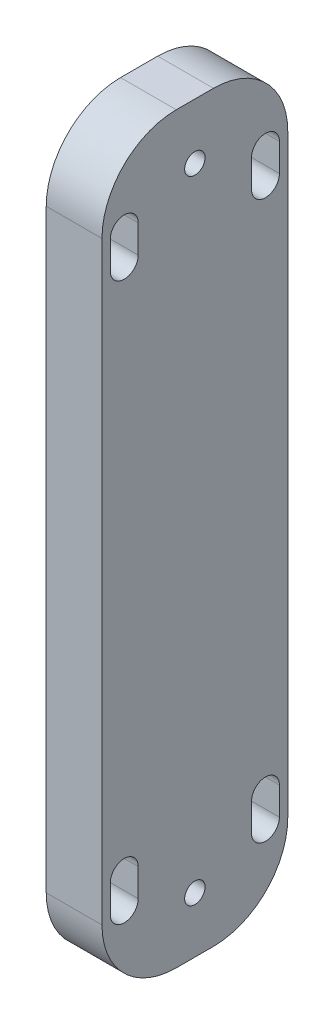
ISO-10303-21;
HEADER;
FILE_DESCRIPTION(('STEP AP214'),'2;1');
FILE_NAME('part.step','',(''),(''),'','','');
FILE_SCHEMA(('AUTOMOTIVE_DESIGN { 1 0 10303 214 1 1 1 1 }'));
ENDSEC;
DATA;
#1=APPLICATION_CONTEXT('core data for automotive mechanical design processes');
#2=APPLICATION_PROTOCOL_DEFINITION('international standard','automotive_design',2000,#1);
#3=PRODUCT_CONTEXT('',#1,'mechanical');
#4=PRODUCT('Part','Part','',(#3));
#5=PRODUCT_RELATED_PRODUCT_CATEGORY('part','',(#4));
#6=PRODUCT_DEFINITION_FORMATION('','',#4);
#7=PRODUCT_DEFINITION_CONTEXT('part definition',#1,'design');
#8=PRODUCT_DEFINITION('design','',#6,#7);
#9=PRODUCT_DEFINITION_SHAPE('','',#8);
#10=(LENGTH_UNIT() NAMED_UNIT(*) SI_UNIT(.MILLI.,.METRE.));
#11=(NAMED_UNIT(*) PLANE_ANGLE_UNIT() SI_UNIT($,.RADIAN.));
#12=(NAMED_UNIT(*) SI_UNIT($,.STERADIAN.) SOLID_ANGLE_UNIT());
#13=UNCERTAINTY_MEASURE_WITH_UNIT(LENGTH_MEASURE(1.E-05),#10,'distance_accuracy_value','');
#14=(GEOMETRIC_REPRESENTATION_CONTEXT(3) GLOBAL_UNCERTAINTY_ASSIGNED_CONTEXT((#13)) GLOBAL_UNIT_ASSIGNED_CONTEXT((#10,
#11,#12)) REPRESENTATION_CONTEXT('',''));
#15=CARTESIAN_POINT('',(0.,0.,0.));
#16=DIRECTION('',(0.,0.,1.));
#17=DIRECTION('',(1.,0.,0.));
#18=AXIS2_PLACEMENT_3D('',#15,#16,#17);
#19=CARTESIAN_POINT('',(3.,36.,-6.));
#20=DIRECTION('',(-1.,0.,0.));
#21=DIRECTION('',(0.,0.,1.));
#22=AXIS2_PLACEMENT_3D('',#19,#20,#21);
#23=PLANE('',#22);
#24=CARTESIAN_POINT('',(3.,4.25,-8.8));
#25=DIRECTION('',(1.,0.,0.));
#26=DIRECTION('',(0.,0.,-1.));
#27=AXIS2_PLACEMENT_3D('',#24,#25,#26);
#28=CIRCLE('',#27,0.750000000000001);
#29=CARTESIAN_POINT('',(3.,4.25,-8.05));
#30=VERTEX_POINT('',#29);
#31=CARTESIAN_POINT('',(3.,4.25,-9.55));
#32=VERTEX_POINT('',#31);
#33=EDGE_CURVE('E232',#30,#32,#28,.T.);
#34=ORIENTED_EDGE('',*,*,#33,.F.);
#35=DIRECTION('',(0.,-1.,0.));
#36=VECTOR('',#35,1.);
#37=CARTESIAN_POINT('',(3.,4.25,-8.05));
#38=LINE('',#37,#36);
#39=CARTESIAN_POINT('',(3.,5.75,-8.05));
#40=VERTEX_POINT('',#39);
#41=EDGE_CURVE('E240',#40,#30,#38,.T.);
#42=ORIENTED_EDGE('',*,*,#41,.F.);
#43=CARTESIAN_POINT('',(3.,5.75,-8.8));
#44=DIRECTION('',(1.,0.,0.));
#45=DIRECTION('',(0.,0.,-1.));
#46=AXIS2_PLACEMENT_3D('',#43,#44,#45);
#47=CIRCLE('',#46,0.750000000000001);
#48=CARTESIAN_POINT('',(3.,5.75,-9.55));
#49=VERTEX_POINT('',#48);
#50=EDGE_CURVE('E237',#49,#40,#47,.T.);
#51=ORIENTED_EDGE('',*,*,#50,.F.);
#52=DIRECTION('',(0.,1.,0.));
#53=VECTOR('',#52,1.);
#54=CARTESIAN_POINT('',(3.,4.25,-9.55));
#55=LINE('',#54,#53);
#56=EDGE_CURVE('E234',#32,#49,#55,.T.);
#57=ORIENTED_EDGE('',*,*,#56,.F.);
#58=EDGE_LOOP('',(#34,#42,#51,#57));
#59=FACE_BOUND('',#58,.T.);
#60=CARTESIAN_POINT('',(3.,35.75,-1.2));
#61=DIRECTION('',(1.,0.,0.));
#62=DIRECTION('',(0.,0.,-1.));
#63=AXIS2_PLACEMENT_3D('',#60,#61,#62);
#64=CIRCLE('',#63,0.749999999999999);
#65=CARTESIAN_POINT('',(3.,35.75,-1.95));
#66=VERTEX_POINT('',#65);
#67=CARTESIAN_POINT('',(3.,35.75,-0.45));
#68=VERTEX_POINT('',#67);
#69=EDGE_CURVE('E306',#66,#68,#64,.T.);
#70=ORIENTED_EDGE('',*,*,#69,.F.);
#71=DIRECTION('',(0.,1.,0.));
#72=VECTOR('',#71,1.);
#73=CARTESIAN_POINT('',(3.,35.75,-1.95));
#74=LINE('',#73,#72);
#75=CARTESIAN_POINT('',(3.,34.25,-1.95));
#76=VERTEX_POINT('',#75);
#77=EDGE_CURVE('E314',#76,#66,#74,.T.);
#78=ORIENTED_EDGE('',*,*,#77,.F.);
#79=CARTESIAN_POINT('',(3.,34.25,-1.2));
#80=DIRECTION('',(1.,0.,0.));
#81=DIRECTION('',(0.,0.,-1.));
#82=AXIS2_PLACEMENT_3D('',#79,#80,#81);
#83=CIRCLE('',#82,0.749999999999999);
#84=CARTESIAN_POINT('',(3.,34.25,-0.450000000000001));
#85=VERTEX_POINT('',#84);
#86=EDGE_CURVE('E311',#85,#76,#83,.T.);
#87=ORIENTED_EDGE('',*,*,#86,.F.);
#88=DIRECTION('',(0.,-1.,0.));
#89=VECTOR('',#88,1.);
#90=CARTESIAN_POINT('',(3.,35.75,-0.45));
#91=LINE('',#90,#89);
#92=EDGE_CURVE('E308',#68,#85,#91,.T.);
#93=ORIENTED_EDGE('',*,*,#92,.F.);
#94=EDGE_LOOP('',(#70,#78,#87,#93));
#95=FACE_BOUND('',#94,.T.);
#96=CARTESIAN_POINT('',(3.,36.,-6.));
#97=DIRECTION('',(1.,0.,0.));
#98=DIRECTION('',(0.,0.,1.));
#99=AXIS2_PLACEMENT_3D('',#96,#97,#98);
#100=CIRCLE('',#99,3.99999999999999);
#101=CARTESIAN_POINT('',(3.,36.,-10.));
#102=VERTEX_POINT('',#101);
#103=CARTESIAN_POINT('',(3.,40.,-6.));
#104=VERTEX_POINT('',#103);
#105=EDGE_CURVE('E337',#102,#104,#100,.T.);
#106=ORIENTED_EDGE('',*,*,#105,.T.);
#107=DIRECTION('',(0.,0.,1.));
#108=VECTOR('',#107,1.);
#109=CARTESIAN_POINT('',(3.,40.,-4.));
#110=LINE('',#109,#108);
#111=CARTESIAN_POINT('',(3.,40.,-4.));
#112=VERTEX_POINT('',#111);
#113=EDGE_CURVE('E340',#104,#112,#110,.T.);
#114=ORIENTED_EDGE('',*,*,#113,.T.);
#115=CARTESIAN_POINT('',(3.,36.,-4.));
#116=DIRECTION('',(1.,0.,0.));
#117=DIRECTION('',(0.,0.,1.));
#118=AXIS2_PLACEMENT_3D('',#115,#116,#117);
#119=CIRCLE('',#118,3.99999999999999);
#120=CARTESIAN_POINT('',(3.,36.,0.));
#121=VERTEX_POINT('',#120);
#122=EDGE_CURVE('E343',#112,#121,#119,.T.);
#123=ORIENTED_EDGE('',*,*,#122,.T.);
#124=DIRECTION('',(0.,-1.,0.));
#125=VECTOR('',#124,1.);
#126=CARTESIAN_POINT('',(3.,4.,0.));
#127=LINE('',#126,#125);
#128=CARTESIAN_POINT('',(3.,4.,0.));
#129=VERTEX_POINT('',#128);
#130=EDGE_CURVE('E345',#121,#129,#127,.T.);
#131=ORIENTED_EDGE('',*,*,#130,.T.);
#132=CARTESIAN_POINT('',(3.,4.,-4.));
#133=DIRECTION('',(1.,0.,0.));
#134=DIRECTION('',(0.,0.,1.));
#135=AXIS2_PLACEMENT_3D('',#132,#133,#134);
#136=CIRCLE('',#135,4.);
#137=CARTESIAN_POINT('',(3.,0.,-4.));
#138=VERTEX_POINT('',#137);
#139=EDGE_CURVE('E347',#129,#138,#136,.T.);
#140=ORIENTED_EDGE('',*,*,#139,.T.);
#141=DIRECTION('',(0.,0.,-1.));
#142=VECTOR('',#141,1.);
#143=CARTESIAN_POINT('',(3.,0.,-4.));
#144=LINE('',#143,#142);
#145=CARTESIAN_POINT('',(3.,0.,-6.));
#146=VERTEX_POINT('',#145);
#147=EDGE_CURVE('E349',#138,#146,#144,.T.);
#148=ORIENTED_EDGE('',*,*,#147,.T.);
#149=CARTESIAN_POINT('',(3.,4.,-6.));
#150=DIRECTION('',(1.,0.,0.));
#151=DIRECTION('',(0.,0.,-1.));
#152=AXIS2_PLACEMENT_3D('',#149,#150,#151);
#153=CIRCLE('',#152,4.);
#154=CARTESIAN_POINT('',(3.,4.,-10.));
#155=VERTEX_POINT('',#154);
#156=EDGE_CURVE('E351',#146,#155,#153,.T.);
#157=ORIENTED_EDGE('',*,*,#156,.T.);
#158=DIRECTION('',(0.,1.,0.));
#159=VECTOR('',#158,1.);
#160=CARTESIAN_POINT('',(3.,4.,-10.));
#161=LINE('',#160,#159);
#162=EDGE_CURVE('E353',#155,#102,#161,.T.);
#163=ORIENTED_EDGE('',*,*,#162,.T.);
#164=EDGE_LOOP('',(#106,#114,#123,#131,#140,#148,#157,#163));
#165=FACE_BOUND('',#164,.T.);
#166=CARTESIAN_POINT('',(3.,4.25,-1.2));
#167=DIRECTION('',(1.,0.,0.));
#168=DIRECTION('',(0.,0.,-1.));
#169=AXIS2_PLACEMENT_3D('',#166,#167,#168);
#170=CIRCLE('',#169,0.75);
#171=CARTESIAN_POINT('',(3.,4.25,-0.45));
#172=VERTEX_POINT('',#171);
#173=CARTESIAN_POINT('',(3.,4.25,-1.95));
#174=VERTEX_POINT('',#173);
#175=EDGE_CURVE('E275',#172,#174,#170,.T.);
#176=ORIENTED_EDGE('',*,*,#175,.F.);
#177=DIRECTION('',(0.,-1.,0.));
#178=VECTOR('',#177,1.);
#179=CARTESIAN_POINT('',(3.,4.25,-0.45));
#180=LINE('',#179,#178);
#181=CARTESIAN_POINT('',(3.,5.75,-0.449999999999999));
#182=VERTEX_POINT('',#181);
#183=EDGE_CURVE('E283',#182,#172,#180,.T.);
#184=ORIENTED_EDGE('',*,*,#183,.F.);
#185=CARTESIAN_POINT('',(3.,5.75,-1.2));
#186=DIRECTION('',(1.,0.,0.));
#187=DIRECTION('',(0.,0.,-1.));
#188=AXIS2_PLACEMENT_3D('',#185,#186,#187);
#189=CIRCLE('',#188,0.75);
#190=CARTESIAN_POINT('',(3.,5.75,-1.95));
#191=VERTEX_POINT('',#190);
#192=EDGE_CURVE('E280',#191,#182,#189,.T.);
#193=ORIENTED_EDGE('',*,*,#192,.F.);
#194=DIRECTION('',(0.,1.,0.));
#195=VECTOR('',#194,1.);
#196=CARTESIAN_POINT('',(3.,4.25,-1.95));
#197=LINE('',#196,#195);
#198=EDGE_CURVE('E277',#174,#191,#197,.T.);
#199=ORIENTED_EDGE('',*,*,#198,.F.);
#200=EDGE_LOOP('',(#176,#184,#193,#199));
#201=FACE_BOUND('',#200,.T.);
#202=CARTESIAN_POINT('',(3.,3.,-5.));
#203=DIRECTION('',(1.,0.,0.));
#204=DIRECTION('',(0.,0.,-1.));
#205=AXIS2_PLACEMENT_3D('',#202,#203,#204);
#206=CIRCLE('',#205,0.55);
#207=CARTESIAN_POINT('',(3.,3.,-5.55));
#208=VERTEX_POINT('',#207);
#209=EDGE_CURVE('E269',#208,#208,#206,.T.);
#210=ORIENTED_EDGE('',*,*,#209,.F.);
#211=EDGE_LOOP('',(#210));
#212=FACE_BOUND('',#211,.T.);
#213=CARTESIAN_POINT('',(3.,37.,-5.));
#214=DIRECTION('',(1.,0.,0.));
#215=DIRECTION('',(0.,0.,-1.));
#216=AXIS2_PLACEMENT_3D('',#213,#214,#215);
#217=CIRCLE('',#216,0.549999999999607);
#218=CARTESIAN_POINT('',(3.,37.,-5.54999999999961));
#219=VERTEX_POINT('',#218);
#220=EDGE_CURVE('E263',#219,#219,#217,.T.);
#221=ORIENTED_EDGE('',*,*,#220,.F.);
#222=EDGE_LOOP('',(#221));
#223=FACE_BOUND('',#222,.T.);
#224=CARTESIAN_POINT('',(3.,34.25,-8.8));
#225=DIRECTION('',(1.,0.,0.));
#226=DIRECTION('',(0.,0.,-1.));
#227=AXIS2_PLACEMENT_3D('',#224,#225,#226);
#228=CIRCLE('',#227,0.750000000000001);
#229=CARTESIAN_POINT('',(3.,34.25,-8.05));
#230=VERTEX_POINT('',#229);
#231=CARTESIAN_POINT('',(3.,34.25,-9.55));
#232=VERTEX_POINT('',#231);
#233=EDGE_CURVE('E196',#230,#232,#228,.T.);
#234=ORIENTED_EDGE('',*,*,#233,.F.);
#235=DIRECTION('',(0.,-1.,0.));
#236=VECTOR('',#235,1.);
#237=CARTESIAN_POINT('',(3.,34.25,-8.05));
#238=LINE('',#237,#236);
#239=CARTESIAN_POINT('',(3.,35.75,-8.05));
#240=VERTEX_POINT('',#239);
#241=EDGE_CURVE('E218',#240,#230,#238,.T.);
#242=ORIENTED_EDGE('',*,*,#241,.F.);
#243=CARTESIAN_POINT('',(3.,35.75,-8.8));
#244=DIRECTION('',(1.,0.,0.));
#245=DIRECTION('',(0.,0.,-1.));
#246=AXIS2_PLACEMENT_3D('',#243,#244,#245);
#247=CIRCLE('',#246,0.750000000000001);
#248=CARTESIAN_POINT('',(3.,35.75,-9.55));
#249=VERTEX_POINT('',#248);
#250=EDGE_CURVE('E216',#249,#240,#247,.T.);
#251=ORIENTED_EDGE('',*,*,#250,.F.);
#252=DIRECTION('',(0.,1.,0.));
#253=VECTOR('',#252,1.);
#254=CARTESIAN_POINT('',(3.,34.25,-9.55));
#255=LINE('',#254,#253);
#256=EDGE_CURVE('E204',#232,#249,#255,.T.);
#257=ORIENTED_EDGE('',*,*,#256,.F.);
#258=EDGE_LOOP('',(#234,#242,#251,#257));
#259=FACE_BOUND('',#258,.T.);
#260=ADVANCED_FACE('F35',(#59,#95,#165,#201,#212,#223,#259),#23,.F.);
#261=CARTESIAN_POINT('',(0.,36.,-6.));
#262=DIRECTION('',(-1.,0.,0.));
#263=DIRECTION('',(0.,0.,1.));
#264=AXIS2_PLACEMENT_3D('',#261,#262,#263);
#265=PLANE('',#264);
#266=CARTESIAN_POINT('',(0.,3.,-5.));
#267=DIRECTION('',(1.,0.,0.));
#268=DIRECTION('',(0.,0.,-1.));
#269=AXIS2_PLACEMENT_3D('',#266,#267,#268);
#270=CIRCLE('',#269,0.55);
#271=CARTESIAN_POINT('',(0.,3.,-5.55));
#272=VERTEX_POINT('',#271);
#273=EDGE_CURVE('E266',#272,#272,#270,.T.);
#274=ORIENTED_EDGE('',*,*,#273,.T.);
#275=EDGE_LOOP('',(#274));
#276=FACE_BOUND('',#275,.T.);
#277=CARTESIAN_POINT('',(0.,36.,-6.));
#278=DIRECTION('',(1.,0.,0.));
#279=DIRECTION('',(0.,0.,1.));
#280=AXIS2_PLACEMENT_3D('',#277,#278,#279);
#281=CIRCLE('',#280,3.99999999999999);
#282=CARTESIAN_POINT('',(0.,36.,-10.));
#283=VERTEX_POINT('',#282);
#284=CARTESIAN_POINT('',(0.,40.,-6.));
#285=VERTEX_POINT('',#284);
#286=EDGE_CURVE('E336',#283,#285,#281,.T.);
#287=ORIENTED_EDGE('',*,*,#286,.F.);
#288=DIRECTION('',(0.,1.,0.));
#289=VECTOR('',#288,1.);
#290=CARTESIAN_POINT('',(0.,4.,-10.));
#291=LINE('',#290,#289);
#292=CARTESIAN_POINT('',(0.,4.,-10.));
#293=VERTEX_POINT('',#292);
#294=EDGE_CURVE('E341',#293,#283,#291,.T.);
#295=ORIENTED_EDGE('',*,*,#294,.F.);
#296=CARTESIAN_POINT('',(0.,4.,-6.));
#297=DIRECTION('',(1.,0.,0.));
#298=DIRECTION('',(0.,0.,-1.));
#299=AXIS2_PLACEMENT_3D('',#296,#297,#298);
#300=CIRCLE('',#299,4.);
#301=CARTESIAN_POINT('',(0.,0.,-6.));
#302=VERTEX_POINT('',#301);
#303=EDGE_CURVE('E368',#302,#293,#300,.T.);
#304=ORIENTED_EDGE('',*,*,#303,.F.);
#305=DIRECTION('',(0.,0.,-1.));
#306=VECTOR('',#305,1.);
#307=CARTESIAN_POINT('',(0.,0.,-4.));
#308=LINE('',#307,#306);
#309=CARTESIAN_POINT('',(0.,0.,-4.));
#310=VERTEX_POINT('',#309);
#311=EDGE_CURVE('E366',#310,#302,#308,.T.);
#312=ORIENTED_EDGE('',*,*,#311,.F.);
#313=CARTESIAN_POINT('',(0.,4.,-4.));
#314=DIRECTION('',(1.,0.,0.));
#315=DIRECTION('',(0.,0.,1.));
#316=AXIS2_PLACEMENT_3D('',#313,#314,#315);
#317=CIRCLE('',#316,4.);
#318=CARTESIAN_POINT('',(0.,4.,0.));
#319=VERTEX_POINT('',#318);
#320=EDGE_CURVE('E364',#319,#310,#317,.T.);
#321=ORIENTED_EDGE('',*,*,#320,.F.);
#322=DIRECTION('',(0.,-1.,0.));
#323=VECTOR('',#322,1.);
#324=CARTESIAN_POINT('',(0.,4.,0.));
#325=LINE('',#324,#323);
#326=CARTESIAN_POINT('',(0.,36.,0.));
#327=VERTEX_POINT('',#326);
#328=EDGE_CURVE('E362',#327,#319,#325,.T.);
#329=ORIENTED_EDGE('',*,*,#328,.F.);
#330=CARTESIAN_POINT('',(0.,36.,-4.));
#331=DIRECTION('',(1.,0.,0.));
#332=DIRECTION('',(0.,0.,1.));
#333=AXIS2_PLACEMENT_3D('',#330,#331,#332);
#334=CIRCLE('',#333,3.99999999999999);
#335=CARTESIAN_POINT('',(0.,40.,-4.));
#336=VERTEX_POINT('',#335);
#337=EDGE_CURVE('E360',#336,#327,#334,.T.);
#338=ORIENTED_EDGE('',*,*,#337,.F.);
#339=DIRECTION('',(0.,0.,1.));
#340=VECTOR('',#339,1.);
#341=CARTESIAN_POINT('',(0.,40.,-4.));
#342=LINE('',#341,#340);
#343=EDGE_CURVE('E358',#285,#336,#342,.T.);
#344=ORIENTED_EDGE('',*,*,#343,.F.);
#345=EDGE_LOOP('',(#287,#295,#304,#312,#321,#329,#338,#344));
#346=FACE_BOUND('',#345,.T.);
#347=DIRECTION('',(0.,1.,0.));
#348=VECTOR('',#347,1.);
#349=CARTESIAN_POINT('',(0.,35.75,-1.95));
#350=LINE('',#349,#348);
#351=CARTESIAN_POINT('',(0.,34.25,-1.95));
#352=VERTEX_POINT('',#351);
#353=CARTESIAN_POINT('',(0.,35.75,-1.95));
#354=VERTEX_POINT('',#353);
#355=EDGE_CURVE('E309',#352,#354,#350,.T.);
#356=ORIENTED_EDGE('',*,*,#355,.T.);
#357=CARTESIAN_POINT('',(0.,35.75,-1.2));
#358=DIRECTION('',(1.,0.,0.));
#359=DIRECTION('',(0.,0.,-1.));
#360=AXIS2_PLACEMENT_3D('',#357,#358,#359);
#361=CIRCLE('',#360,0.749999999999999);
#362=CARTESIAN_POINT('',(0.,35.75,-0.45));
#363=VERTEX_POINT('',#362);
#364=EDGE_CURVE('E305',#354,#363,#361,.T.);
#365=ORIENTED_EDGE('',*,*,#364,.T.);
#366=DIRECTION('',(0.,-1.,0.));
#367=VECTOR('',#366,1.);
#368=CARTESIAN_POINT('',(0.,35.75,-0.45));
#369=LINE('',#368,#367);
#370=CARTESIAN_POINT('',(0.,34.25,-0.450000000000001));
#371=VERTEX_POINT('',#370);
#372=EDGE_CURVE('E319',#363,#371,#369,.T.);
#373=ORIENTED_EDGE('',*,*,#372,.T.);
#374=CARTESIAN_POINT('',(0.,34.25,-1.2));
#375=DIRECTION('',(1.,0.,0.));
#376=DIRECTION('',(0.,0.,-1.));
#377=AXIS2_PLACEMENT_3D('',#374,#375,#376);
#378=CIRCLE('',#377,0.749999999999999);
#379=EDGE_CURVE('E322',#371,#352,#378,.T.);
#380=ORIENTED_EDGE('',*,*,#379,.T.);
#381=EDGE_LOOP('',(#356,#365,#373,#380));
#382=FACE_BOUND('',#381,.T.);
#383=DIRECTION('',(0.,-1.,0.));
#384=VECTOR('',#383,1.);
#385=CARTESIAN_POINT('',(0.,4.25,-0.45));
#386=LINE('',#385,#384);
#387=CARTESIAN_POINT('',(0.,5.75,-0.449999999999999));
#388=VERTEX_POINT('',#387);
#389=CARTESIAN_POINT('',(0.,4.25,-0.45));
#390=VERTEX_POINT('',#389);
#391=EDGE_CURVE('E278',#388,#390,#386,.T.);
#392=ORIENTED_EDGE('',*,*,#391,.T.);
#393=CARTESIAN_POINT('',(0.,4.25,-1.2));
#394=DIRECTION('',(1.,0.,0.));
#395=DIRECTION('',(0.,0.,-1.));
#396=AXIS2_PLACEMENT_3D('',#393,#394,#395);
#397=CIRCLE('',#396,0.75);
#398=CARTESIAN_POINT('',(0.,4.25,-1.95));
#399=VERTEX_POINT('',#398);
#400=EDGE_CURVE('E272',#390,#399,#397,.T.);
#401=ORIENTED_EDGE('',*,*,#400,.T.);
#402=DIRECTION('',(0.,1.,0.));
#403=VECTOR('',#402,1.);
#404=CARTESIAN_POINT('',(0.,4.25,-1.95));
#405=LINE('',#404,#403);
#406=CARTESIAN_POINT('',(0.,5.75,-1.95));
#407=VERTEX_POINT('',#406);
#408=EDGE_CURVE('E288',#399,#407,#405,.T.);
#409=ORIENTED_EDGE('',*,*,#408,.T.);
#410=CARTESIAN_POINT('',(0.,5.75,-1.2));
#411=DIRECTION('',(1.,0.,0.));
#412=DIRECTION('',(0.,0.,-1.));
#413=AXIS2_PLACEMENT_3D('',#410,#411,#412);
#414=CIRCLE('',#413,0.75);
#415=EDGE_CURVE('E291',#407,#388,#414,.T.);
#416=ORIENTED_EDGE('',*,*,#415,.T.);
#417=EDGE_LOOP('',(#392,#401,#409,#416));
#418=FACE_BOUND('',#417,.T.);
#419=CARTESIAN_POINT('',(0.,37.,-5.));
#420=DIRECTION('',(1.,0.,0.));
#421=DIRECTION('',(0.,0.,-1.));
#422=AXIS2_PLACEMENT_3D('',#419,#420,#421);
#423=CIRCLE('',#422,0.549999999999607);
#424=CARTESIAN_POINT('',(0.,37.,-5.54999999999961));
#425=VERTEX_POINT('',#424);
#426=EDGE_CURVE('E262',#425,#425,#423,.T.);
#427=ORIENTED_EDGE('',*,*,#426,.T.);
#428=EDGE_LOOP('',(#427));
#429=FACE_BOUND('',#428,.T.);
#430=DIRECTION('',(0.,-1.,0.));
#431=VECTOR('',#430,1.);
#432=CARTESIAN_POINT('',(0.,4.25,-8.05));
#433=LINE('',#432,#431);
#434=CARTESIAN_POINT('',(0.,5.75,-8.05));
#435=VERTEX_POINT('',#434);
#436=CARTESIAN_POINT('',(0.,4.25,-8.05));
#437=VERTEX_POINT('',#436);
#438=EDGE_CURVE('E235',#435,#437,#433,.T.);
#439=ORIENTED_EDGE('',*,*,#438,.T.);
#440=CARTESIAN_POINT('',(0.,4.25,-8.8));
#441=DIRECTION('',(1.,0.,0.));
#442=DIRECTION('',(0.,0.,-1.));
#443=AXIS2_PLACEMENT_3D('',#440,#441,#442);
#444=CIRCLE('',#443,0.750000000000001);
#445=CARTESIAN_POINT('',(0.,4.25,-9.55));
#446=VERTEX_POINT('',#445);
#447=EDGE_CURVE('E212',#437,#446,#444,.T.);
#448=ORIENTED_EDGE('',*,*,#447,.T.);
#449=DIRECTION('',(0.,1.,0.));
#450=VECTOR('',#449,1.);
#451=CARTESIAN_POINT('',(0.,4.25,-9.55));
#452=LINE('',#451,#450);
#453=CARTESIAN_POINT('',(0.,5.75,-9.55));
#454=VERTEX_POINT('',#453);
#455=EDGE_CURVE('E245',#446,#454,#452,.T.);
#456=ORIENTED_EDGE('',*,*,#455,.T.);
#457=CARTESIAN_POINT('',(0.,5.75,-8.8));
#458=DIRECTION('',(1.,0.,0.));
#459=DIRECTION('',(0.,0.,-1.));
#460=AXIS2_PLACEMENT_3D('',#457,#458,#459);
#461=CIRCLE('',#460,0.750000000000001);
#462=EDGE_CURVE('E248',#454,#435,#461,.T.);
#463=ORIENTED_EDGE('',*,*,#462,.T.);
#464=EDGE_LOOP('',(#439,#448,#456,#463));
#465=FACE_BOUND('',#464,.T.);
#466=DIRECTION('',(0.,-1.,0.));
#467=VECTOR('',#466,1.);
#468=CARTESIAN_POINT('',(0.,34.25,-8.05));
#469=LINE('',#468,#467);
#470=CARTESIAN_POINT('',(0.,35.75,-8.05));
#471=VERTEX_POINT('',#470);
#472=CARTESIAN_POINT('',(0.,34.25,-8.05));
#473=VERTEX_POINT('',#472);
#474=EDGE_CURVE('E205',#471,#473,#469,.T.);
#475=ORIENTED_EDGE('',*,*,#474,.T.);
#476=CARTESIAN_POINT('',(0.,34.25,-8.8));
#477=DIRECTION('',(1.,0.,0.));
#478=DIRECTION('',(0.,0.,-1.));
#479=AXIS2_PLACEMENT_3D('',#476,#477,#478);
#480=CIRCLE('',#479,0.750000000000001);
#481=CARTESIAN_POINT('',(0.,34.25,-9.55));
#482=VERTEX_POINT('',#481);
#483=EDGE_CURVE('E58',#473,#482,#480,.T.);
#484=ORIENTED_EDGE('',*,*,#483,.T.);
#485=DIRECTION('',(0.,1.,0.));
#486=VECTOR('',#485,1.);
#487=CARTESIAN_POINT('',(0.,34.25,-9.55));
#488=LINE('',#487,#486);
#489=CARTESIAN_POINT('',(0.,35.75,-9.55));
#490=VERTEX_POINT('',#489);
#491=EDGE_CURVE('E211',#482,#490,#488,.T.);
#492=ORIENTED_EDGE('',*,*,#491,.T.);
#493=CARTESIAN_POINT('',(0.,35.75,-8.8));
#494=DIRECTION('',(1.,0.,0.));
#495=DIRECTION('',(0.,0.,-1.));
#496=AXIS2_PLACEMENT_3D('',#493,#494,#495);
#497=CIRCLE('',#496,0.750000000000001);
#498=EDGE_CURVE('E224',#490,#471,#497,.T.);
#499=ORIENTED_EDGE('',*,*,#498,.T.);
#500=EDGE_LOOP('',(#475,#484,#492,#499));
#501=FACE_BOUND('',#500,.T.);
#502=ADVANCED_FACE('F398',(#276,#346,#382,#418,#429,#465,#501),#265,.T.);
#503=CARTESIAN_POINT('',(3.,36.,-6.));
#504=DIRECTION('',(-1.,0.,0.));
#505=DIRECTION('',(0.,0.,1.));
#506=AXIS2_PLACEMENT_3D('',#503,#504,#505);
#507=CYLINDRICAL_SURFACE('',#506,3.99999999999999);
#508=ORIENTED_EDGE('',*,*,#286,.T.);
#509=DIRECTION('',(-1.,0.,0.));
#510=VECTOR('',#509,1.);
#511=CARTESIAN_POINT('',(3.,40.,-6.));
#512=LINE('',#511,#510);
#513=EDGE_CURVE('E11',#104,#285,#512,.T.);
#514=ORIENTED_EDGE('',*,*,#513,.F.);
#515=ORIENTED_EDGE('',*,*,#105,.F.);
#516=DIRECTION('',(-1.,0.,0.));
#517=VECTOR('',#516,1.);
#518=CARTESIAN_POINT('',(3.,36.,-10.));
#519=LINE('',#518,#517);
#520=EDGE_CURVE('E355',#102,#283,#519,.T.);
#521=ORIENTED_EDGE('',*,*,#520,.T.);
#522=EDGE_LOOP('',(#508,#514,#515,#521));
#523=FACE_BOUND('',#522,.T.);
#524=ADVANCED_FACE('F37',(#523),#507,.T.);
#525=CARTESIAN_POINT('',(3.,40.,-4.));
#526=DIRECTION('',(0.,-1.,0.));
#527=DIRECTION('',(0.,0.,-1.));
#528=AXIS2_PLACEMENT_3D('',#525,#526,#527);
#529=PLANE('',#528);
#530=ORIENTED_EDGE('',*,*,#343,.T.);
#531=DIRECTION('',(-1.,0.,0.));
#532=VECTOR('',#531,1.);
#533=CARTESIAN_POINT('',(3.,40.,-4.));
#534=LINE('',#533,#532);
#535=EDGE_CURVE('E43',#112,#336,#534,.T.);
#536=ORIENTED_EDGE('',*,*,#535,.F.);
#537=ORIENTED_EDGE('',*,*,#113,.F.);
#538=ORIENTED_EDGE('',*,*,#513,.T.);
#539=EDGE_LOOP('',(#530,#536,#537,#538));
#540=FACE_BOUND('',#539,.T.);
#541=ADVANCED_FACE('F416',(#540),#529,.F.);
#542=CARTESIAN_POINT('',(3.,36.,-4.));
#543=DIRECTION('',(-1.,0.,0.));
#544=DIRECTION('',(0.,0.,1.));
#545=AXIS2_PLACEMENT_3D('',#542,#543,#544);
#546=CYLINDRICAL_SURFACE('',#545,3.99999999999999);
#547=ORIENTED_EDGE('',*,*,#337,.T.);
#548=DIRECTION('',(-1.,0.,0.));
#549=VECTOR('',#548,1.);
#550=CARTESIAN_POINT('',(3.,36.,0.));
#551=LINE('',#550,#549);
#552=EDGE_CURVE('E385',#121,#327,#551,.T.);
#553=ORIENTED_EDGE('',*,*,#552,.F.);
#554=ORIENTED_EDGE('',*,*,#122,.F.);
#555=ORIENTED_EDGE('',*,*,#535,.T.);
#556=EDGE_LOOP('',(#547,#553,#554,#555));
#557=FACE_BOUND('',#556,.T.);
#558=ADVANCED_FACE('F392',(#557),#546,.T.);
#559=CARTESIAN_POINT('',(3.,4.,0.));
#560=DIRECTION('',(0.,0.,-1.));
#561=DIRECTION('',(-1.,0.,0.));
#562=AXIS2_PLACEMENT_3D('',#559,#560,#561);
#563=PLANE('',#562);
#564=ORIENTED_EDGE('',*,*,#328,.T.);
#565=DIRECTION('',(-1.,0.,0.));
#566=VECTOR('',#565,1.);
#567=CARTESIAN_POINT('',(3.,4.,0.));
#568=LINE('',#567,#566);
#569=EDGE_CURVE('E382',#129,#319,#568,.T.);
#570=ORIENTED_EDGE('',*,*,#569,.F.);
#571=ORIENTED_EDGE('',*,*,#130,.F.);
#572=ORIENTED_EDGE('',*,*,#552,.T.);
#573=EDGE_LOOP('',(#564,#570,#571,#572));
#574=FACE_BOUND('',#573,.T.);
#575=ADVANCED_FACE('F404',(#574),#563,.F.);
#576=CARTESIAN_POINT('',(3.,4.,-4.));
#577=DIRECTION('',(-1.,0.,0.));
#578=DIRECTION('',(0.,0.,1.));
#579=AXIS2_PLACEMENT_3D('',#576,#577,#578);
#580=CYLINDRICAL_SURFACE('',#579,4.);
#581=ORIENTED_EDGE('',*,*,#320,.T.);
#582=DIRECTION('',(-1.,0.,0.));
#583=VECTOR('',#582,1.);
#584=CARTESIAN_POINT('',(3.,0.,-4.));
#585=LINE('',#584,#583);
#586=EDGE_CURVE('E379',#138,#310,#585,.T.);
#587=ORIENTED_EDGE('',*,*,#586,.F.);
#588=ORIENTED_EDGE('',*,*,#139,.F.);
#589=ORIENTED_EDGE('',*,*,#569,.T.);
#590=EDGE_LOOP('',(#581,#587,#588,#589));
#591=FACE_BOUND('',#590,.T.);
#592=ADVANCED_FACE('F408',(#591),#580,.T.);
#593=CARTESIAN_POINT('',(3.,0.,-4.));
#594=DIRECTION('',(0.,1.,0.));
#595=DIRECTION('',(0.,0.,1.));
#596=AXIS2_PLACEMENT_3D('',#593,#594,#595);
#597=PLANE('',#596);
#598=ORIENTED_EDGE('',*,*,#311,.T.);
#599=DIRECTION('',(-1.,0.,0.));
#600=VECTOR('',#599,1.);
#601=CARTESIAN_POINT('',(3.,0.,-6.));
#602=LINE('',#601,#600);
#603=EDGE_CURVE('E376',#146,#302,#602,.T.);
#604=ORIENTED_EDGE('',*,*,#603,.F.);
#605=ORIENTED_EDGE('',*,*,#147,.F.);
#606=ORIENTED_EDGE('',*,*,#586,.T.);
#607=EDGE_LOOP('',(#598,#604,#605,#606));
#608=FACE_BOUND('',#607,.T.);
#609=ADVANCED_FACE('F429',(#608),#597,.F.);
#610=CARTESIAN_POINT('',(3.,4.,-6.));
#611=DIRECTION('',(-1.,0.,0.));
#612=DIRECTION('',(0.,0.,1.));
#613=AXIS2_PLACEMENT_3D('',#610,#611,#612);
#614=CYLINDRICAL_SURFACE('',#613,4.);
#615=ORIENTED_EDGE('',*,*,#303,.T.);
#616=DIRECTION('',(-1.,0.,0.));
#617=VECTOR('',#616,1.);
#618=CARTESIAN_POINT('',(3.,4.,-10.));
#619=LINE('',#618,#617);
#620=EDGE_CURVE('E373',#155,#293,#619,.T.);
#621=ORIENTED_EDGE('',*,*,#620,.F.);
#622=ORIENTED_EDGE('',*,*,#156,.F.);
#623=ORIENTED_EDGE('',*,*,#603,.T.);
#624=EDGE_LOOP('',(#615,#621,#622,#623));
#625=FACE_BOUND('',#624,.T.);
#626=ADVANCED_FACE('F427',(#625),#614,.T.);
#627=CARTESIAN_POINT('',(3.,4.,-10.));
#628=DIRECTION('',(0.,0.,1.));
#629=DIRECTION('',(1.,0.,0.));
#630=AXIS2_PLACEMENT_3D('',#627,#628,#629);
#631=PLANE('',#630);
#632=ORIENTED_EDGE('',*,*,#294,.T.);
#633=ORIENTED_EDGE('',*,*,#520,.F.);
#634=ORIENTED_EDGE('',*,*,#162,.F.);
#635=ORIENTED_EDGE('',*,*,#620,.T.);
#636=EDGE_LOOP('',(#632,#633,#634,#635));
#637=FACE_BOUND('',#636,.T.);
#638=ADVANCED_FACE('F422',(#637),#631,.F.);
#639=CARTESIAN_POINT('',(3.,35.75,-1.2));
#640=DIRECTION('',(-1.,0.,0.));
#641=DIRECTION('',(0.,0.,1.));
#642=AXIS2_PLACEMENT_3D('',#639,#640,#641);
#643=CYLINDRICAL_SURFACE('',#642,0.749999999999999);
#644=ORIENTED_EDGE('',*,*,#364,.F.);
#645=DIRECTION('',(-1.,0.,0.));
#646=VECTOR('',#645,1.);
#647=CARTESIAN_POINT('',(3.,35.75,-1.95));
#648=LINE('',#647,#646);
#649=EDGE_CURVE('E316',#66,#354,#648,.T.);
#650=ORIENTED_EDGE('',*,*,#649,.F.);
#651=ORIENTED_EDGE('',*,*,#69,.T.);
#652=DIRECTION('',(-1.,0.,0.));
#653=VECTOR('',#652,1.);
#654=CARTESIAN_POINT('',(3.,35.75,-0.45));
#655=LINE('',#654,#653);
#656=EDGE_CURVE('E333',#68,#363,#655,.T.);
#657=ORIENTED_EDGE('',*,*,#656,.T.);
#658=EDGE_LOOP('',(#644,#650,#651,#657));
#659=FACE_BOUND('',#658,.T.);
#660=ADVANCED_FACE('F449',(#659),#643,.F.);
#661=CARTESIAN_POINT('',(3.,35.75,-0.45));
#662=DIRECTION('',(0.,0.,-1.));
#663=DIRECTION('',(0.,1.,0.));
#664=AXIS2_PLACEMENT_3D('',#661,#662,#663);
#665=PLANE('',#664);
#666=ORIENTED_EDGE('',*,*,#372,.F.);
#667=ORIENTED_EDGE('',*,*,#656,.F.);
#668=ORIENTED_EDGE('',*,*,#92,.T.);
#669=DIRECTION('',(-1.,0.,0.));
#670=VECTOR('',#669,1.);
#671=CARTESIAN_POINT('',(3.,34.25,-0.450000000000001));
#672=LINE('',#671,#670);
#673=EDGE_CURVE('E331',#85,#371,#672,.T.);
#674=ORIENTED_EDGE('',*,*,#673,.T.);
#675=EDGE_LOOP('',(#666,#667,#668,#674));
#676=FACE_BOUND('',#675,.T.);
#677=ADVANCED_FACE('F456',(#676),#665,.T.);
#678=CARTESIAN_POINT('',(3.,34.25,-1.2));
#679=DIRECTION('',(-1.,0.,0.));
#680=DIRECTION('',(0.,0.,1.));
#681=AXIS2_PLACEMENT_3D('',#678,#679,#680);
#682=CYLINDRICAL_SURFACE('',#681,0.749999999999999);
#683=ORIENTED_EDGE('',*,*,#379,.F.);
#684=ORIENTED_EDGE('',*,*,#673,.F.);
#685=ORIENTED_EDGE('',*,*,#86,.T.);
#686=DIRECTION('',(-1.,0.,0.));
#687=VECTOR('',#686,1.);
#688=CARTESIAN_POINT('',(3.,34.25,-1.95));
#689=LINE('',#688,#687);
#690=EDGE_CURVE('E329',#76,#352,#689,.T.);
#691=ORIENTED_EDGE('',*,*,#690,.T.);
#692=EDGE_LOOP('',(#683,#684,#685,#691));
#693=FACE_BOUND('',#692,.T.);
#694=ADVANCED_FACE('F461',(#693),#682,.F.);
#695=CARTESIAN_POINT('',(3.,35.75,-1.95));
#696=DIRECTION('',(0.,0.,1.));
#697=DIRECTION('',(0.,-1.,0.));
#698=AXIS2_PLACEMENT_3D('',#695,#696,#697);
#699=PLANE('',#698);
#700=ORIENTED_EDGE('',*,*,#355,.F.);
#701=ORIENTED_EDGE('',*,*,#690,.F.);
#702=ORIENTED_EDGE('',*,*,#77,.T.);
#703=ORIENTED_EDGE('',*,*,#649,.T.);
#704=EDGE_LOOP('',(#700,#701,#702,#703));
#705=FACE_BOUND('',#704,.T.);
#706=ADVANCED_FACE('F468',(#705),#699,.T.);
#707=CARTESIAN_POINT('',(3.,4.25,-1.2));
#708=DIRECTION('',(-1.,0.,0.));
#709=DIRECTION('',(0.,0.,1.));
#710=AXIS2_PLACEMENT_3D('',#707,#708,#709);
#711=CYLINDRICAL_SURFACE('',#710,0.75);
#712=ORIENTED_EDGE('',*,*,#400,.F.);
#713=DIRECTION('',(-1.,0.,0.));
#714=VECTOR('',#713,1.);
#715=CARTESIAN_POINT('',(3.,4.25,-0.45));
#716=LINE('',#715,#714);
#717=EDGE_CURVE('E285',#172,#390,#716,.T.);
#718=ORIENTED_EDGE('',*,*,#717,.F.);
#719=ORIENTED_EDGE('',*,*,#175,.T.);
#720=DIRECTION('',(-1.,0.,0.));
#721=VECTOR('',#720,1.);
#722=CARTESIAN_POINT('',(3.,4.25,-1.95));
#723=LINE('',#722,#721);
#724=EDGE_CURVE('E302',#174,#399,#723,.T.);
#725=ORIENTED_EDGE('',*,*,#724,.T.);
#726=EDGE_LOOP('',(#712,#718,#719,#725));
#727=FACE_BOUND('',#726,.T.);
#728=ADVANCED_FACE('F481',(#727),#711,.F.);
#729=CARTESIAN_POINT('',(3.,4.25,-1.95));
#730=DIRECTION('',(0.,0.,1.));
#731=DIRECTION('',(0.,-1.,0.));
#732=AXIS2_PLACEMENT_3D('',#729,#730,#731);
#733=PLANE('',#732);
#734=ORIENTED_EDGE('',*,*,#408,.F.);
#735=ORIENTED_EDGE('',*,*,#724,.F.);
#736=ORIENTED_EDGE('',*,*,#198,.T.);
#737=DIRECTION('',(-1.,0.,0.));
#738=VECTOR('',#737,1.);
#739=CARTESIAN_POINT('',(3.,5.75,-1.95));
#740=LINE('',#739,#738);
#741=EDGE_CURVE('E300',#191,#407,#740,.T.);
#742=ORIENTED_EDGE('',*,*,#741,.T.);
#743=EDGE_LOOP('',(#734,#735,#736,#742));
#744=FACE_BOUND('',#743,.T.);
#745=ADVANCED_FACE('F486',(#744),#733,.T.);
#746=CARTESIAN_POINT('',(3.,5.75,-1.2));
#747=DIRECTION('',(-1.,0.,0.));
#748=DIRECTION('',(0.,0.,1.));
#749=AXIS2_PLACEMENT_3D('',#746,#747,#748);
#750=CYLINDRICAL_SURFACE('',#749,0.75);
#751=ORIENTED_EDGE('',*,*,#415,.F.);
#752=ORIENTED_EDGE('',*,*,#741,.F.);
#753=ORIENTED_EDGE('',*,*,#192,.T.);
#754=DIRECTION('',(-1.,0.,0.));
#755=VECTOR('',#754,1.);
#756=CARTESIAN_POINT('',(3.,5.75,-0.449999999999999));
#757=LINE('',#756,#755);
#758=EDGE_CURVE('E298',#182,#388,#757,.T.);
#759=ORIENTED_EDGE('',*,*,#758,.T.);
#760=EDGE_LOOP('',(#751,#752,#753,#759));
#761=FACE_BOUND('',#760,.T.);
#762=ADVANCED_FACE('F490',(#761),#750,.F.);
#763=CARTESIAN_POINT('',(3.,4.25,-0.45));
#764=DIRECTION('',(0.,0.,-1.));
#765=DIRECTION('',(0.,1.,0.));
#766=AXIS2_PLACEMENT_3D('',#763,#764,#765);
#767=PLANE('',#766);
#768=ORIENTED_EDGE('',*,*,#391,.F.);
#769=ORIENTED_EDGE('',*,*,#758,.F.);
#770=ORIENTED_EDGE('',*,*,#183,.T.);
#771=ORIENTED_EDGE('',*,*,#717,.T.);
#772=EDGE_LOOP('',(#768,#769,#770,#771));
#773=FACE_BOUND('',#772,.T.);
#774=ADVANCED_FACE('F494',(#773),#767,.T.);
#775=CARTESIAN_POINT('',(3.,3.,-5.));
#776=DIRECTION('',(-1.,0.,0.));
#777=DIRECTION('',(0.,0.,1.));
#778=AXIS2_PLACEMENT_3D('',#775,#776,#777);
#779=CYLINDRICAL_SURFACE('',#778,0.55);
#780=ORIENTED_EDGE('',*,*,#209,.T.);
#781=EDGE_LOOP('',(#780));
#782=FACE_BOUND('',#781,.T.);
#783=ORIENTED_EDGE('',*,*,#273,.F.);
#784=EDGE_LOOP('',(#783));
#785=FACE_BOUND('',#784,.T.);
#786=ADVANCED_FACE('F498',(#782,#785),#779,.F.);
#787=CARTESIAN_POINT('',(3.,37.,-5.));
#788=DIRECTION('',(-1.,0.,0.));
#789=DIRECTION('',(0.,0.,1.));
#790=AXIS2_PLACEMENT_3D('',#787,#788,#789);
#791=CYLINDRICAL_SURFACE('',#790,0.549999999999607);
#792=ORIENTED_EDGE('',*,*,#220,.T.);
#793=EDGE_LOOP('',(#792));
#794=FACE_BOUND('',#793,.T.);
#795=ORIENTED_EDGE('',*,*,#426,.F.);
#796=EDGE_LOOP('',(#795));
#797=FACE_BOUND('',#796,.T.);
#798=ADVANCED_FACE('F502',(#794,#797),#791,.F.);
#799=CARTESIAN_POINT('',(3.,4.25,-8.8));
#800=DIRECTION('',(-1.,0.,0.));
#801=DIRECTION('',(0.,0.,1.));
#802=AXIS2_PLACEMENT_3D('',#799,#800,#801);
#803=CYLINDRICAL_SURFACE('',#802,0.750000000000001);
#804=ORIENTED_EDGE('',*,*,#447,.F.);
#805=DIRECTION('',(-1.,0.,0.));
#806=VECTOR('',#805,1.);
#807=CARTESIAN_POINT('',(3.,4.25,-8.05));
#808=LINE('',#807,#806);
#809=EDGE_CURVE('E242',#30,#437,#808,.T.);
#810=ORIENTED_EDGE('',*,*,#809,.F.);
#811=ORIENTED_EDGE('',*,*,#33,.T.);
#812=DIRECTION('',(-1.,0.,0.));
#813=VECTOR('',#812,1.);
#814=CARTESIAN_POINT('',(3.,4.25,-9.55));
#815=LINE('',#814,#813);
#816=EDGE_CURVE('E259',#32,#446,#815,.T.);
#817=ORIENTED_EDGE('',*,*,#816,.T.);
#818=EDGE_LOOP('',(#804,#810,#811,#817));
#819=FACE_BOUND('',#818,.T.);
#820=ADVANCED_FACE('F506',(#819),#803,.F.);
#821=CARTESIAN_POINT('',(3.,4.25,-9.55));
#822=DIRECTION('',(0.,0.,1.));
#823=DIRECTION('',(1.,0.,0.));
#824=AXIS2_PLACEMENT_3D('',#821,#822,#823);
#825=PLANE('',#824);
#826=ORIENTED_EDGE('',*,*,#455,.F.);
#827=ORIENTED_EDGE('',*,*,#816,.F.);
#828=ORIENTED_EDGE('',*,*,#56,.T.);
#829=DIRECTION('',(-1.,0.,0.));
#830=VECTOR('',#829,1.);
#831=CARTESIAN_POINT('',(3.,5.75,-9.55));
#832=LINE('',#831,#830);
#833=EDGE_CURVE('E257',#49,#454,#832,.T.);
#834=ORIENTED_EDGE('',*,*,#833,.T.);
#835=EDGE_LOOP('',(#826,#827,#828,#834));
#836=FACE_BOUND('',#835,.T.);
#837=ADVANCED_FACE('F510',(#836),#825,.T.);
#838=CARTESIAN_POINT('',(3.,5.75,-8.8));
#839=DIRECTION('',(-1.,0.,0.));
#840=DIRECTION('',(0.,0.,1.));
#841=AXIS2_PLACEMENT_3D('',#838,#839,#840);
#842=CYLINDRICAL_SURFACE('',#841,0.750000000000001);
#843=ORIENTED_EDGE('',*,*,#462,.F.);
#844=ORIENTED_EDGE('',*,*,#833,.F.);
#845=ORIENTED_EDGE('',*,*,#50,.T.);
#846=DIRECTION('',(-1.,0.,0.));
#847=VECTOR('',#846,1.);
#848=CARTESIAN_POINT('',(3.,5.75,-8.05));
#849=LINE('',#848,#847);
#850=EDGE_CURVE('E255',#40,#435,#849,.T.);
#851=ORIENTED_EDGE('',*,*,#850,.T.);
#852=EDGE_LOOP('',(#843,#844,#845,#851));
#853=FACE_BOUND('',#852,.T.);
#854=ADVANCED_FACE('F514',(#853),#842,.F.);
#855=CARTESIAN_POINT('',(3.,4.25,-8.05));
#856=DIRECTION('',(0.,0.,-1.));
#857=DIRECTION('',(-1.,0.,0.));
#858=AXIS2_PLACEMENT_3D('',#855,#856,#857);
#859=PLANE('',#858);
#860=ORIENTED_EDGE('',*,*,#438,.F.);
#861=ORIENTED_EDGE('',*,*,#850,.F.);
#862=ORIENTED_EDGE('',*,*,#41,.T.);
#863=ORIENTED_EDGE('',*,*,#809,.T.);
#864=EDGE_LOOP('',(#860,#861,#862,#863));
#865=FACE_BOUND('',#864,.T.);
#866=ADVANCED_FACE('F518',(#865),#859,.T.);
#867=CARTESIAN_POINT('',(3.,34.25,-8.8));
#868=DIRECTION('',(-1.,0.,0.));
#869=DIRECTION('',(0.,0.,1.));
#870=AXIS2_PLACEMENT_3D('',#867,#868,#869);
#871=CYLINDRICAL_SURFACE('',#870,0.750000000000001);
#872=ORIENTED_EDGE('',*,*,#483,.F.);
#873=DIRECTION('',(-1.,0.,0.));
#874=VECTOR('',#873,1.);
#875=CARTESIAN_POINT('',(3.,34.25,-8.05));
#876=LINE('',#875,#874);
#877=EDGE_CURVE('E200',#230,#473,#876,.T.);
#878=ORIENTED_EDGE('',*,*,#877,.F.);
#879=ORIENTED_EDGE('',*,*,#233,.T.);
#880=DIRECTION('',(-1.,0.,0.));
#881=VECTOR('',#880,1.);
#882=CARTESIAN_POINT('',(3.,34.25,-9.55));
#883=LINE('',#882,#881);
#884=EDGE_CURVE('E199',#232,#482,#883,.T.);
#885=ORIENTED_EDGE('',*,*,#884,.T.);
#886=EDGE_LOOP('',(#872,#878,#879,#885));
#887=FACE_BOUND('',#886,.T.);
#888=ADVANCED_FACE('F198',(#887),#871,.F.);
#889=CARTESIAN_POINT('',(3.,34.25,-9.55));
#890=DIRECTION('',(0.,0.,1.));
#891=DIRECTION('',(1.,0.,0.));
#892=AXIS2_PLACEMENT_3D('',#889,#890,#891);
#893=PLANE('',#892);
#894=ORIENTED_EDGE('',*,*,#491,.F.);
#895=ORIENTED_EDGE('',*,*,#884,.F.);
#896=ORIENTED_EDGE('',*,*,#256,.T.);
#897=DIRECTION('',(-1.,0.,0.));
#898=VECTOR('',#897,1.);
#899=CARTESIAN_POINT('',(3.,35.75,-9.55));
#900=LINE('',#899,#898);
#901=EDGE_CURVE('E213',#249,#490,#900,.T.);
#902=ORIENTED_EDGE('',*,*,#901,.T.);
#903=EDGE_LOOP('',(#894,#895,#896,#902));
#904=FACE_BOUND('',#903,.T.);
#905=ADVANCED_FACE('F208',(#904),#893,.T.);
#906=CARTESIAN_POINT('',(3.,35.75,-8.8));
#907=DIRECTION('',(-1.,0.,0.));
#908=DIRECTION('',(0.,0.,1.));
#909=AXIS2_PLACEMENT_3D('',#906,#907,#908);
#910=CYLINDRICAL_SURFACE('',#909,0.750000000000001);
#911=ORIENTED_EDGE('',*,*,#498,.F.);
#912=ORIENTED_EDGE('',*,*,#901,.F.);
#913=ORIENTED_EDGE('',*,*,#250,.T.);
#914=DIRECTION('',(-1.,0.,0.));
#915=VECTOR('',#914,1.);
#916=CARTESIAN_POINT('',(3.,35.75,-8.05));
#917=LINE('',#916,#915);
#918=EDGE_CURVE('E50',#240,#471,#917,.T.);
#919=ORIENTED_EDGE('',*,*,#918,.T.);
#920=EDGE_LOOP('',(#911,#912,#913,#919));
#921=FACE_BOUND('',#920,.T.);
#922=ADVANCED_FACE('F527',(#921),#910,.F.);
#923=CARTESIAN_POINT('',(3.,34.25,-8.05));
#924=DIRECTION('',(0.,0.,-1.));
#925=DIRECTION('',(-1.,0.,0.));
#926=AXIS2_PLACEMENT_3D('',#923,#924,#925);
#927=PLANE('',#926);
#928=ORIENTED_EDGE('',*,*,#474,.F.);
#929=ORIENTED_EDGE('',*,*,#918,.F.);
#930=ORIENTED_EDGE('',*,*,#241,.T.);
#931=ORIENTED_EDGE('',*,*,#877,.T.);
#932=EDGE_LOOP('',(#928,#929,#930,#931));
#933=FACE_BOUND('',#932,.T.);
#934=ADVANCED_FACE('F530',(#933),#927,.T.);
#935=CLOSED_SHELL('',(#260,#502,#524,#541,#558,#575,#592,#609,#626,#638,#660,#677,#694,#706,
#728,#745,#762,#774,#786,#798,#820,#837,#854,#866,#888,#905,#922,#934));
#936=MANIFOLD_SOLID_BREP('B2',#935);
#937=ADVANCED_BREP_SHAPE_REPRESENTATION('',(#18,#936),#14);
#938=SHAPE_DEFINITION_REPRESENTATION(#9,#937);
ENDSEC;
END-ISO-10303-21;
